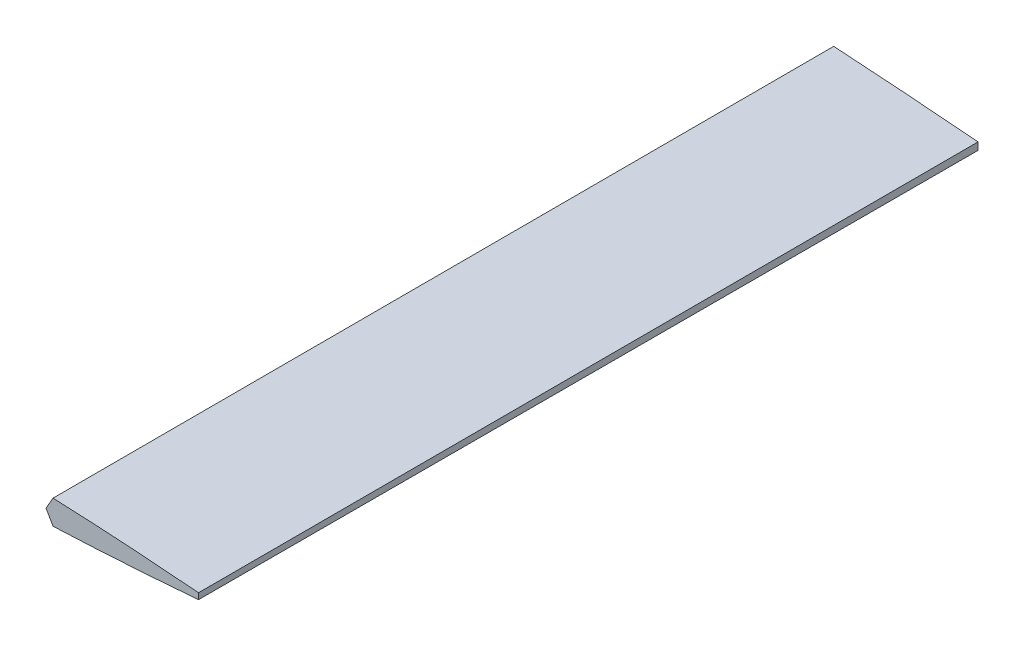
ISO-10303-21;
HEADER;
FILE_DESCRIPTION(('STEP AP214'),'2;1');
FILE_NAME('part.step','',(''),(''),'','','');
FILE_SCHEMA(('AUTOMOTIVE_DESIGN { 1 0 10303 214 1 1 1 1 }'));
ENDSEC;
DATA;
#1=APPLICATION_CONTEXT('core data for automotive mechanical design processes');
#2=APPLICATION_PROTOCOL_DEFINITION('international standard','automotive_design',2000,#1);
#3=PRODUCT_CONTEXT('',#1,'mechanical');
#4=PRODUCT('Part','Part','',(#3));
#5=PRODUCT_RELATED_PRODUCT_CATEGORY('part','',(#4));
#6=PRODUCT_DEFINITION_FORMATION('','',#4);
#7=PRODUCT_DEFINITION_CONTEXT('part definition',#1,'design');
#8=PRODUCT_DEFINITION('design','',#6,#7);
#9=PRODUCT_DEFINITION_SHAPE('','',#8);
#10=(LENGTH_UNIT() NAMED_UNIT(*) SI_UNIT(.MILLI.,.METRE.));
#11=(NAMED_UNIT(*) PLANE_ANGLE_UNIT() SI_UNIT($,.RADIAN.));
#12=(NAMED_UNIT(*) SI_UNIT($,.STERADIAN.) SOLID_ANGLE_UNIT());
#13=UNCERTAINTY_MEASURE_WITH_UNIT(LENGTH_MEASURE(1.E-05),#10,'distance_accuracy_value','');
#14=(GEOMETRIC_REPRESENTATION_CONTEXT(3) GLOBAL_UNCERTAINTY_ASSIGNED_CONTEXT((#13)) GLOBAL_UNIT_ASSIGNED_CONTEXT((#10,
#11,#12)) REPRESENTATION_CONTEXT('',''));
#15=CARTESIAN_POINT('',(0.,0.,0.));
#16=DIRECTION('',(0.,0.,1.));
#17=DIRECTION('',(1.,0.,0.));
#18=AXIS2_PLACEMENT_3D('',#15,#16,#17);
#19=CARTESIAN_POINT('',(156.193426648918,3.38414053459089,12.));
#20=DIRECTION('',(0.,0.,-1.));
#21=DIRECTION('',(-1.,0.,0.));
#22=AXIS2_PLACEMENT_3D('',#19,#20,#21);
#23=PLANE('',#22);
#24=CARTESIAN_POINT('',(181.999999999997,1.32081554480552,12.));
#25=CARTESIAN_POINT('',(179.833359123358,1.50799986169961,12.));
#26=CARTESIAN_POINT('',(177.666377862953,1.69121001024706,12.));
#27=CARTESIAN_POINT('',(173.331819550159,2.05042028614808,12.));
#28=CARTESIAN_POINT('',(171.164242498353,2.22642042052185,12.));
#29=CARTESIAN_POINT('',(166.828576681648,2.57194908039793,12.));
#30=CARTESIAN_POINT('',(164.660487917539,2.74147761581983,12.));
#31=CARTESIAN_POINT('',(160.323804442609,3.07396314442731,12.));
#32=CARTESIAN_POINT('',(158.155209731375,3.23692013223226,12.));
#33=CARTESIAN_POINT('',(153.851788543839,3.55365573061228,12.));
#34=CARTESIAN_POINT('',(151.716969744311,3.70753866121165,12.));
#35=CARTESIAN_POINT('',(147.446881827911,4.00893907800575,12.));
#36=CARTESIAN_POINT('',(145.311612710789,4.15645656067524,12.));
#37=CARTESIAN_POINT('',(141.040641322936,4.44520028049767,12.));
#38=CARTESIAN_POINT('',(138.904939050707,4.58642649552244,12.));
#39=CARTESIAN_POINT('',(134.633107912896,4.86225228693051,12.));
#40=CARTESIAN_POINT('',(132.496979047533,4.99685186672991,12.));
#41=CARTESIAN_POINT('',(130.36063531099,5.1279707814234,12.));
#42=B_SPLINE_CURVE_WITH_KNOTS('',3,(#24,#25,#26,#27,#28,#29,#30,#31,#32,#33,#34,#35,#36,#37,#38,
#39,#40,#41),.UNSPECIFIED.,.F.,.F.,(4,2,2,2,2,2,2,2,4),(0.,6.52412683856262,13.0482473246093,
19.5723578101605,26.0964736373928,32.5175371779438,38.9386042744909,45.3596939539631,
51.7807803232607),.UNSPECIFIED.);
#43=CARTESIAN_POINT('',(181.999999999997,1.32081554480552,12.));
#44=VERTEX_POINT('',#43);
#45=CARTESIAN_POINT('',(130.36063531099,5.1279707814234,12.));
#46=VERTEX_POINT('',#45);
#47=EDGE_CURVE('E299',#44,#46,#42,.T.);
#48=ORIENTED_EDGE('',*,*,#47,.F.);
#49=DIRECTION('',(0.,1.,0.));
#50=VECTOR('',#49,1.);
#51=CARTESIAN_POINT('',(181.999999999997,0.,12.));
#52=LINE('',#51,#50);
#53=CARTESIAN_POINT('',(181.999999999997,-1.32081554480553,12.));
#54=VERTEX_POINT('',#53);
#55=EDGE_CURVE('E14',#54,#44,#52,.T.);
#56=ORIENTED_EDGE('',*,*,#55,.F.);
#57=CARTESIAN_POINT('',(130.36063531099,-5.12797077896629,12.));
#58=CARTESIAN_POINT('',(132.531258784026,-4.99474593345585,12.));
#59=CARTESIAN_POINT('',(134.701660598214,-4.85793083609563,12.));
#60=CARTESIAN_POINT('',(139.042021598999,-4.57746528558185,12.));
#61=CARTESIAN_POINT('',(141.211980785823,-4.43381483594635,12.));
#62=CARTESIAN_POINT('',(145.551457992163,-4.1400236900687,12.));
#63=CARTESIAN_POINT('',(147.720976011975,-3.98988299820635,12.));
#64=CARTESIAN_POINT('',(152.059548136035,-3.68302297890028,12.));
#65=CARTESIAN_POINT('',(154.228602240033,-3.52630364792416,12.));
#66=CARTESIAN_POINT('',(158.53196151656,-3.20873586227835,12.));
#67=CARTESIAN_POINT('',(160.66627438813,-3.04799173123674,12.));
#68=CARTESIAN_POINT('',(164.934412523196,-2.72014679582137,12.));
#69=CARTESIAN_POINT('',(167.068237786476,-2.55304598864396,12.));
#70=CARTESIAN_POINT('',(171.335397993675,-2.21256380774694,12.));
#71=CARTESIAN_POINT('',(173.468732935229,-2.03918240435686,12.));
#72=CARTESIAN_POINT('',(177.734822006585,-1.68542431460893,12.));
#73=CARTESIAN_POINT('',(179.86757613648,-1.5050476293756,12.));
#74=CARTESIAN_POINT('',(181.999999999997,-1.32081554480553,12.));
#75=B_SPLINE_CURVE_WITH_KNOTS('',3,(#57,#58,#59,#60,#61,#62,#63,#64,#65,#66,#67,#68,#69,#70,#71,
#72,#73,#74),.UNSPECIFIED.,.F.,.F.,(4,2,2,2,2,2,2,2,4),(0.,6.52411923666664,13.0482351154895,
19.5723465917277,26.0964615711323,32.5175242289771,38.9385897189026,45.359685546857,
51.7807803425985),.UNSPECIFIED.);
#76=CARTESIAN_POINT('',(130.360635310991,-5.12797077896629,12.));
#77=VERTEX_POINT('',#76);
#78=EDGE_CURVE('E159',#77,#54,#75,.T.);
#79=ORIENTED_EDGE('',*,*,#78,.F.);
#80=DIRECTION('',(0.500000000097699,-0.866025403728032,0.));
#81=VECTOR('',#80,1.);
#82=CARTESIAN_POINT('',(133.132980828583,-9.92981407088131,12.));
#83=LINE('',#82,#81);
#84=CARTESIAN_POINT('',(127.400000000182,1.4020102006345E-10,12.));
#85=VERTEX_POINT('',#84);
#86=EDGE_CURVE('E215',#85,#77,#83,.T.);
#87=ORIENTED_EDGE('',*,*,#86,.F.);
#88=DIRECTION('',(0.499999999999992,0.866025403784443,0.));
#89=VECTOR('',#88,1.);
#90=CARTESIAN_POINT('',(95.5499999999552,-55.1658182210417,12.));
#91=LINE('',#90,#89);
#92=EDGE_CURVE('E167',#85,#46,#91,.T.);
#93=ORIENTED_EDGE('',*,*,#92,.T.);
#94=EDGE_LOOP('',(#48,#56,#79,#87,#93));
#95=FACE_BOUND('',#94,.T.);
#96=ADVANCED_FACE('F148',(#95),#23,.T.);
#97=CARTESIAN_POINT('',(155.975855666843,2.99767279901712,291.));
#98=DIRECTION('',(0.,0.,-1.));
#99=DIRECTION('',(-1.,0.,0.));
#100=AXIS2_PLACEMENT_3D('',#97,#98,#99);
#101=PLANE('',#100);
#102=DIRECTION('',(0.,1.,0.));
#103=VECTOR('',#102,1.);
#104=CARTESIAN_POINT('',(181.999999999939,-1.07461252476691,291.));
#105=LINE('',#104,#103);
#106=CARTESIAN_POINT('',(181.999999999939,-1.07461252476691,291.));
#107=VERTEX_POINT('',#106);
#108=CARTESIAN_POINT('',(181.999999999939,1.07461252476691,291.));
#109=VERTEX_POINT('',#108);
#110=EDGE_CURVE('E287',#107,#109,#105,.T.);
#111=ORIENTED_EDGE('',*,*,#110,.T.);
#112=CARTESIAN_POINT('',(181.999999999939,1.07461252476691,291.));
#113=CARTESIAN_POINT('',(181.666677884339,1.10254199827224,291.));
#114=CARTESIAN_POINT('',(177.334932393538,1.46372191069599,291.));
#115=CARTESIAN_POINT('',(169.003952027464,2.1163331942516,291.));
#116=CARTESIAN_POINT('',(157.003598720147,2.94943403105284,291.));
#117=CARTESIAN_POINT('',(145.003725550487,3.67409726817603,291.));
#118=CARTESIAN_POINT('',(135.973779736777,4.11691387264871,291.));
#119=CARTESIAN_POINT('',(130.94442006121,4.31940386882277,291.));
#120=CARTESIAN_POINT('',(129.916511772735,4.35872624832819,291.));
#121=B_SPLINE_CURVE_WITH_KNOTS('',3,(#112,#113,#114,#115,#116,#117,#118,#119,#120),
.UNSPECIFIED.,.F.,.F.,(4,1,1,1,1,1,4),(0.0455982589690502,0.0497417146704998,0.099443402111095,
0.149112224036195,0.198750974066914,0.248359097492202,0.261101398762122),.UNSPECIFIED.);
#122=CARTESIAN_POINT('',(129.916511772735,4.35872624832819,291.));
#123=VERTEX_POINT('',#122);
#124=EDGE_CURVE('E185',#109,#123,#121,.T.);
#125=ORIENTED_EDGE('',*,*,#124,.T.);
#126=DIRECTION('',(0.499999999999974,0.866025403784454,0.));
#127=VECTOR('',#126,1.);
#128=CARTESIAN_POINT('',(127.399999999939,0.,291.));
#129=LINE('',#128,#127);
#130=CARTESIAN_POINT('',(127.399999999939,0.,291.));
#131=VERTEX_POINT('',#130);
#132=EDGE_CURVE('E194',#131,#123,#129,.T.);
#133=ORIENTED_EDGE('',*,*,#132,.F.);
#134=DIRECTION('',(0.499999999999813,-0.866025403784546,0.));
#135=VECTOR('',#134,1.);
#136=CARTESIAN_POINT('',(127.399999999939,0.,291.));
#137=LINE('',#136,#135);
#138=CARTESIAN_POINT('',(129.916511772734,-4.35872624832823,291.));
#139=VERTEX_POINT('',#138);
#140=EDGE_CURVE('E213',#131,#139,#137,.T.);
#141=ORIENTED_EDGE('',*,*,#140,.T.);
#142=CARTESIAN_POINT('',(129.916511772734,-4.35872624832823,291.));
#143=CARTESIAN_POINT('',(130.944420061209,-4.3194038688228,291.));
#144=CARTESIAN_POINT('',(135.973779736777,-4.11691387264873,291.));
#145=CARTESIAN_POINT('',(145.003725550487,-3.67409726817603,291.));
#146=CARTESIAN_POINT('',(157.003598720147,-2.94943403105285,291.));
#147=CARTESIAN_POINT('',(169.003952027464,-2.1163331942516,291.));
#148=CARTESIAN_POINT('',(177.334932393538,-1.46372191069599,291.));
#149=CARTESIAN_POINT('',(181.666677884339,-1.10254199827224,291.));
#150=CARTESIAN_POINT('',(181.999999999939,-1.07461252476691,291.));
#151=B_SPLINE_CURVE_WITH_KNOTS('',3,(#142,#143,#144,#145,#146,#147,#148,#149,#150),
.UNSPECIFIED.,.F.,.F.,(4,1,1,1,1,1,4),(0.738898601237873,0.751640902507798,0.801249025933086,
0.850887775963805,0.900556597888905,0.9502582853295,0.95440174103095),.UNSPECIFIED.);
#152=EDGE_CURVE('E223',#139,#107,#151,.T.);
#153=ORIENTED_EDGE('',*,*,#152,.T.);
#154=EDGE_LOOP('',(#111,#125,#133,#141,#153));
#155=FACE_BOUND('',#154,.T.);
#156=ADVANCED_FACE('F237',(#155),#101,.F.);
#157=CARTESIAN_POINT('',(181.999999999939,-1.07461252476691,291.));
#158=CARTESIAN_POINT('',(181.999999999958,-1.15726849684678,197.333333333333));
#159=CARTESIAN_POINT('',(181.999999999978,-1.23992446892665,103.666666666667));
#160=CARTESIAN_POINT('',(181.999999999998,-1.32258044100652,10.));
#161=CARTESIAN_POINT('',(177.665938792946,-1.43776888909469,291.));
#162=CARTESIAN_POINT('',(177.67769081335,-1.52319774690823,197.333333333333));
#163=CARTESIAN_POINT('',(177.689442833755,-1.60862660472178,103.666666666667));
#164=CARTESIAN_POINT('',(177.701194854159,-1.69405546253533,10.));
#165=CARTESIAN_POINT('',(168.994121176362,-2.11996821967403,291.));
#166=CARTESIAN_POINT('',(169.029718757499,-2.21523872134128,197.333333333333));
#167=CARTESIAN_POINT('',(169.065316338636,-2.31050922300853,103.666666666667));
#168=CARTESIAN_POINT('',(169.100913919773,-2.40577972467578,10.));
#169=CARTESIAN_POINT('',(155.977248068591,-3.01926751667828,291.));
#170=CARTESIAN_POINT('',(156.049634603403,-3.14524722396503,197.333333333334));
#171=CARTESIAN_POINT('',(156.122021138216,-3.27122693125177,103.666666666667));
#172=CARTESIAN_POINT('',(156.194407673028,-3.39720663853852,10.));
#173=CARTESIAN_POINT('',(142.952030112556,-3.78917770683134,291.));
#174=CARTESIAN_POINT('',(143.062061950823,-3.96290777039772,197.333333333333));
#175=CARTESIAN_POINT('',(143.172093789089,-4.13663783396409,103.666666666667));
#176=CARTESIAN_POINT('',(143.282125627356,-4.31036789753046,10.));
#177=CARTESIAN_POINT('',(134.262615723923,-4.19246710745475,291.));
#178=CARTESIAN_POINT('',(134.398576169333,-4.41779101096592,197.333333333333));
#179=CARTESIAN_POINT('',(134.534536614744,-4.64311491447709,103.666666666667));
#180=CARTESIAN_POINT('',(134.670497060155,-4.86843881798827,10.));
#181=CARTESIAN_POINT('',(129.916511772734,-4.35872624832823,291.));
#182=CARTESIAN_POINT('',(130.065614179245,-4.61697919111114,197.333333333333));
#183=CARTESIAN_POINT('',(130.214716585757,-4.87523213389405,103.666666666667));
#184=CARTESIAN_POINT('',(130.363818992268,-5.13348507667696,10.));
#185=B_SPLINE_SURFACE_WITH_KNOTS('',3,3,((#157,#158,#159,#160),(#161,#162,#163,#164),(#165,#166,
#167,#168),(#169,#170,#171,#172),(#173,#174,#175,#176),(#177,#178,#179,#180),(#181,#182,#183,
#184)),.UNSPECIFIED.,.F.,.F.,.F.,(4,1,1,1,4),(4,4),(0.,0.25,0.5,0.75,1.),(0.,1.),.UNSPECIFIED.);
#186=CARTESIAN_POINT('',(129.916511772734,-4.35872624832823,291.));
#187=CARTESIAN_POINT('',(130.065614179245,-4.61697919111114,197.333333333333));
#188=CARTESIAN_POINT('',(130.214716585757,-4.87523213389405,103.666666666667));
#189=CARTESIAN_POINT('',(130.363818992268,-5.13348507667696,10.));
#190=B_SPLINE_CURVE_WITH_KNOTS('',3,(#186,#187,#188,#189),.UNSPECIFIED.,.F.,.F.,(4,4),(0.,1.),.UNSPECIFIED.);
#191=EDGE_CURVE('E207',#139,#77,#190,.T.);
#192=CARTESIAN_POINT('',(181.999999999998,-1.32258044100652,10.));
#193=CARTESIAN_POINT('',(181.999999999978,-1.23992446892665,103.666666666667));
#194=CARTESIAN_POINT('',(181.999999999958,-1.15726849684678,197.333333333333));
#195=CARTESIAN_POINT('',(181.999999999939,-1.07461252476691,291.));
#196=B_SPLINE_CURVE_WITH_KNOTS('',3,(#192,#193,#194,#195),.UNSPECIFIED.,.F.,.F.,(4,4),(0.,1.),.UNSPECIFIED.);
#197=EDGE_CURVE('E220',#54,#107,#196,.T.);
#198=ORIENTED_EDGE('',*,*,#152,.F.);
#199=ORIENTED_EDGE('',*,*,#191,.T.);
#200=ORIENTED_EDGE('',*,*,#78,.T.);
#201=ORIENTED_EDGE('',*,*,#197,.T.);
#202=EDGE_LOOP('',(#198,#199,#200,#201));
#203=FACE_BOUND('',#202,.T.);
#204=ADVANCED_FACE('F225',(#203),#185,.T.);
#205=CARTESIAN_POINT('',(127.399999999939,0.,150.5));
#206=DIRECTION('',(0.866025403728032,0.500000000097699,2.02456346622463E-12));
#207=DIRECTION('',(-0.500000000097699,0.866025403728032,0.));
#208=AXIS2_PLACEMENT_3D('',#205,#206,#207);
#209=PLANE('',#208);
#210=CARTESIAN_POINT('',(127.399999999693,-1.42225583530071E-10,291.));
#211=DIRECTION('',(1.75327693422883E-12,1.01228173331011E-12,-1.));
#212=VECTOR('',#211,1.);
#213=LINE('',#210,#212);
#214=EDGE_CURVE('E219',#131,#85,#213,.T.);
#215=ORIENTED_EDGE('',*,*,#214,.T.);
#216=ORIENTED_EDGE('',*,*,#86,.T.);
#217=ORIENTED_EDGE('',*,*,#191,.F.);
#218=ORIENTED_EDGE('',*,*,#140,.F.);
#219=EDGE_LOOP('',(#215,#216,#217,#218));
#220=FACE_BOUND('',#219,.T.);
#221=ADVANCED_FACE('F211',(#220),#209,.F.);
#222=CARTESIAN_POINT('',(182.,0.,3.82189337512688E-11));
#223=DIRECTION('',(1.,0.,2.09994141490488E-13));
#224=DIRECTION('',(2.09994141490488E-13,0.,-1.));
#225=AXIS2_PLACEMENT_3D('',#222,#223,#224);
#226=PLANE('',#225);
#227=ORIENTED_EDGE('',*,*,#197,.F.);
#228=ORIENTED_EDGE('',*,*,#55,.T.);
#229=CARTESIAN_POINT('',(181.999999999939,1.07461252476691,291.));
#230=CARTESIAN_POINT('',(181.999999999959,1.15726849684678,197.333333333333));
#231=CARTESIAN_POINT('',(181.999999999978,1.23992446892665,103.666666666667));
#232=CARTESIAN_POINT('',(181.999999999998,1.32258044100652,10.));
#233=B_SPLINE_CURVE_WITH_KNOTS('',3,(#229,#230,#231,#232),.UNSPECIFIED.,.F.,.F.,(4,4),(0.,1.),.UNSPECIFIED.);
#234=EDGE_CURVE('E297',#109,#44,#233,.T.);
#235=ORIENTED_EDGE('',*,*,#234,.F.);
#236=ORIENTED_EDGE('',*,*,#110,.F.);
#237=EDGE_LOOP('',(#227,#228,#235,#236));
#238=FACE_BOUND('',#237,.T.);
#239=ADVANCED_FACE('F362',(#238),#226,.T.);
#240=CARTESIAN_POINT('',(95.5499999999552,-55.1658182210417,0.));
#241=DIRECTION('',(0.866025403784443,-0.499999999999992,0.));
#242=DIRECTION('',(0.499999999999992,0.866025403784443,0.));
#243=AXIS2_PLACEMENT_3D('',#240,#241,#242);
#244=PLANE('',#243);
#245=CARTESIAN_POINT('',(130.363818992268,5.13348507915168,10.));
#246=CARTESIAN_POINT('',(130.214716585757,4.87523213554385,103.666666666667));
#247=CARTESIAN_POINT('',(130.065614179246,4.61697919193602,197.333333333333));
#248=CARTESIAN_POINT('',(129.916511772735,4.35872624832819,291.));
#249=B_SPLINE_CURVE_WITH_KNOTS('',3,(#245,#246,#247,#248),.UNSPECIFIED.,.F.,.F.,(4,4),(0.,1.),.UNSPECIFIED.);
#250=EDGE_CURVE('E300',#46,#123,#249,.T.);
#251=ORIENTED_EDGE('',*,*,#250,.F.);
#252=ORIENTED_EDGE('',*,*,#92,.F.);
#253=ORIENTED_EDGE('',*,*,#214,.F.);
#254=ORIENTED_EDGE('',*,*,#132,.T.);
#255=EDGE_LOOP('',(#251,#252,#253,#254));
#256=FACE_BOUND('',#255,.T.);
#257=ADVANCED_FACE('F327',(#256),#244,.F.);
#258=CARTESIAN_POINT('',(129.916511772735,4.35872624832819,291.));
#259=CARTESIAN_POINT('',(130.065614179246,4.61697919193602,197.333333333333));
#260=CARTESIAN_POINT('',(130.214716585757,4.87523213554385,103.666666666667));
#261=CARTESIAN_POINT('',(130.363818992268,5.13348507915168,10.));
#262=CARTESIAN_POINT('',(134.262615723924,4.19246710745471,291.));
#263=CARTESIAN_POINT('',(134.398574538955,4.41779111197672,197.333333333333));
#264=CARTESIAN_POINT('',(134.534533353986,4.64311511649872,103.666666666667));
#265=CARTESIAN_POINT('',(134.670492169017,4.86843912102073,10.));
#266=CARTESIAN_POINT('',(142.952030112557,3.7891777068313,291.));
#267=CARTESIAN_POINT('',(143.062057610408,3.96290805983782,197.333333333333));
#268=CARTESIAN_POINT('',(143.172085108259,4.13663841284434,103.666666666667));
#269=CARTESIAN_POINT('',(143.282112606111,4.31036876585086,10.));
#270=CARTESIAN_POINT('',(155.977248068592,3.01926751667824,291.));
#271=CARTESIAN_POINT('',(156.04962850877,3.14524767336683,197.333333333334));
#272=CARTESIAN_POINT('',(156.122008948948,3.27122783005541,103.666666666667));
#273=CARTESIAN_POINT('',(156.194389389126,3.397207986744,10.));
#274=CARTESIAN_POINT('',(168.994121176362,2.11996821967402,291.));
#275=CARTESIAN_POINT('',(169.029713649877,2.21523913460168,197.333333333333));
#276=CARTESIAN_POINT('',(169.065306123392,2.31051004952933,103.666666666667));
#277=CARTESIAN_POINT('',(169.100898596908,2.40578096445698,10.));
#278=CARTESIAN_POINT('',(177.665938792946,1.43776888909467,291.));
#279=CARTESIAN_POINT('',(177.677688727674,1.52319792749615,197.333333333333));
#280=CARTESIAN_POINT('',(177.689438662401,1.60862696589763,103.666666666667));
#281=CARTESIAN_POINT('',(177.701188597129,1.69405600429911,10.));
#282=CARTESIAN_POINT('',(181.999999999939,1.07461252476691,291.));
#283=CARTESIAN_POINT('',(181.999999999959,1.15726849684678,197.333333333333));
#284=CARTESIAN_POINT('',(181.999999999978,1.23992446892665,103.666666666667));
#285=CARTESIAN_POINT('',(181.999999999998,1.32258044100652,10.));
#286=B_SPLINE_SURFACE_WITH_KNOTS('',3,3,((#258,#259,#260,#261),(#262,#263,#264,#265),(#266,#267,
#268,#269),(#270,#271,#272,#273),(#274,#275,#276,#277),(#278,#279,#280,#281),(#282,#283,#284,
#285)),.UNSPECIFIED.,.F.,.F.,.F.,(4,1,1,1,4),(4,4),(0.,0.25,0.5,0.75,1.),(0.,1.),.UNSPECIFIED.);
#287=ORIENTED_EDGE('',*,*,#124,.F.);
#288=ORIENTED_EDGE('',*,*,#234,.T.);
#289=ORIENTED_EDGE('',*,*,#47,.T.);
#290=ORIENTED_EDGE('',*,*,#250,.T.);
#291=EDGE_LOOP('',(#287,#288,#289,#290));
#292=FACE_BOUND('',#291,.T.);
#293=ADVANCED_FACE('F321',(#292),#286,.T.);
#294=CLOSED_SHELL('',(#96,#156,#204,#221,#239,#257,#293));
#295=MANIFOLD_SOLID_BREP('B2',#294);
#296=ADVANCED_BREP_SHAPE_REPRESENTATION('',(#18,#295),#14);
#297=SHAPE_DEFINITION_REPRESENTATION(#9,#296);
ENDSEC;
END-ISO-10303-21;
